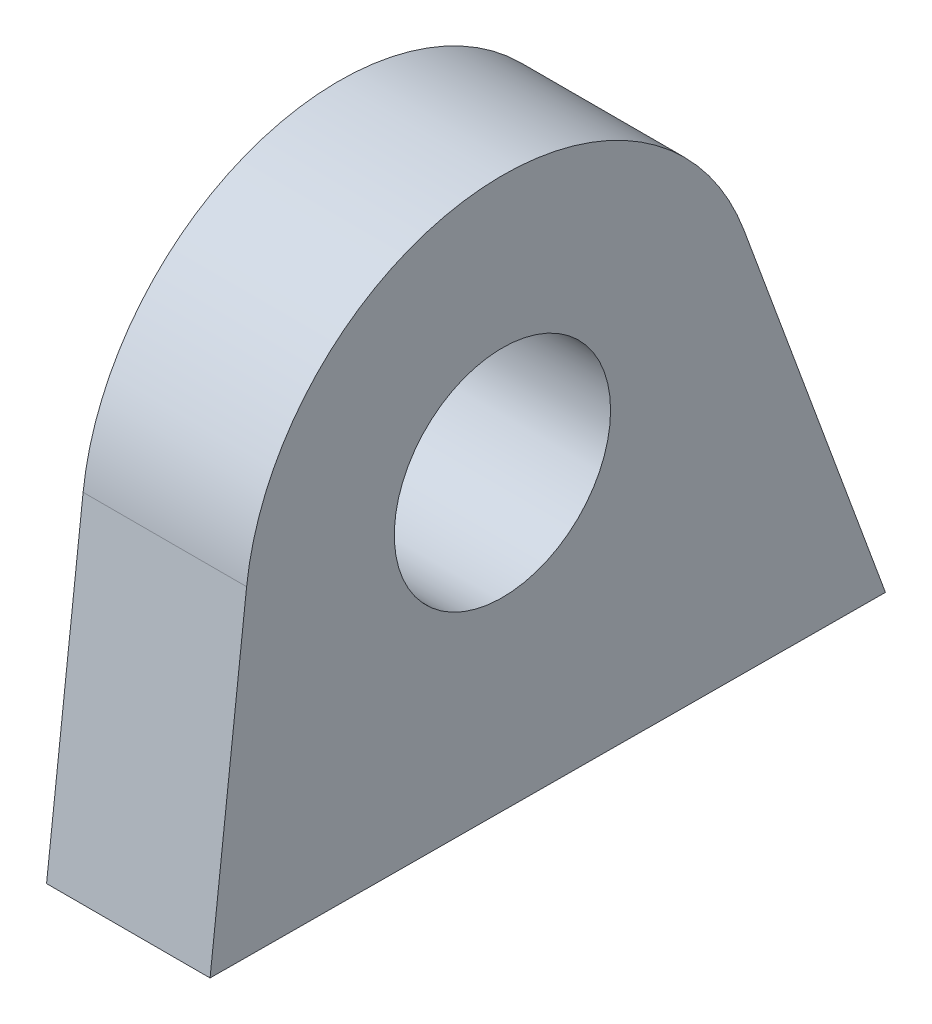
ISO-10303-21;
HEADER;
FILE_DESCRIPTION(('STEP AP214'),'2;1');
FILE_NAME('part.step','',(''),(''),'','','');
FILE_SCHEMA(('AUTOMOTIVE_DESIGN { 1 0 10303 214 1 1 1 1 }'));
ENDSEC;
DATA;
#1=APPLICATION_CONTEXT('core data for automotive mechanical design processes');
#2=APPLICATION_PROTOCOL_DEFINITION('international standard','automotive_design',2000,#1);
#3=PRODUCT_CONTEXT('',#1,'mechanical');
#4=PRODUCT('Part','Part','',(#3));
#5=PRODUCT_RELATED_PRODUCT_CATEGORY('part','',(#4));
#6=PRODUCT_DEFINITION_FORMATION('','',#4);
#7=PRODUCT_DEFINITION_CONTEXT('part definition',#1,'design');
#8=PRODUCT_DEFINITION('design','',#6,#7);
#9=PRODUCT_DEFINITION_SHAPE('','',#8);
#10=(LENGTH_UNIT() NAMED_UNIT(*) SI_UNIT(.MILLI.,.METRE.));
#11=(NAMED_UNIT(*) PLANE_ANGLE_UNIT() SI_UNIT($,.RADIAN.));
#12=(NAMED_UNIT(*) SI_UNIT($,.STERADIAN.) SOLID_ANGLE_UNIT());
#13=UNCERTAINTY_MEASURE_WITH_UNIT(LENGTH_MEASURE(1.E-05),#10,'distance_accuracy_value','');
#14=(GEOMETRIC_REPRESENTATION_CONTEXT(3) GLOBAL_UNCERTAINTY_ASSIGNED_CONTEXT((#13)) GLOBAL_UNIT_ASSIGNED_CONTEXT((#10,
#11,#12)) REPRESENTATION_CONTEXT('',''));
#15=CARTESIAN_POINT('',(0.,0.,0.));
#16=DIRECTION('',(0.,0.,1.));
#17=DIRECTION('',(1.,0.,0.));
#18=AXIS2_PLACEMENT_3D('',#15,#16,#17);
#19=CARTESIAN_POINT('',(77.6424000700384,357.223601629017,-907.3289681282));
#20=DIRECTION('',(1.,0.,0.));
#21=DIRECTION('',(0.,0.,-1.));
#22=AXIS2_PLACEMENT_3D('',#19,#20,#21);
#23=PLANE('',#22);
#24=DIRECTION('',(0.,-0.00556515698933398,-0.99998451439394));
#25=VECTOR('',#24,1.);
#26=CARTESIAN_POINT('',(77.6424000700384,345.904541612259,-895.973808013485));
#27=LINE('',#26,#25);
#28=CARTESIAN_POINT('',(77.6424000700384,345.904541612259,-895.973808013485));
#29=VERTEX_POINT('',#28);
#30=CARTESIAN_POINT('',(77.6424000700384,345.75856303103,-922.204212823623));
#31=VERTEX_POINT('',#30);
#32=EDGE_CURVE('E89',#29,#31,#27,.T.);
#33=ORIENTED_EDGE('',*,*,#32,.T.);
#34=DIRECTION('',(0.,0.938461388630793,0.345384165892363));
#35=VECTOR('',#34,1.);
#36=CARTESIAN_POINT('',(77.6424000700384,360.677443287941,-916.713582014508));
#37=LINE('',#36,#35);
#38=CARTESIAN_POINT('',(77.6424000700384,360.677443287941,-916.713582014508));
#39=VERTEX_POINT('',#38);
#40=EDGE_CURVE('E84',#31,#39,#37,.T.);
#41=ORIENTED_EDGE('',*,*,#40,.T.);
#42=CARTESIAN_POINT('',(77.6424000700384,357.223601629017,-907.3289681282));
#43=DIRECTION('',(1.,0.,0.));
#44=DIRECTION('',(0.,0.,-1.));
#45=AXIS2_PLACEMENT_3D('',#42,#43,#44);
#46=CIRCLE('',#45,10.0000000000001);
#47=CARTESIAN_POINT('',(77.6424000700384,358.356278754938,-897.393323079768));
#48=VERTEX_POINT('',#47);
#49=EDGE_CURVE('E87',#39,#48,#46,.T.);
#50=ORIENTED_EDGE('',*,*,#49,.T.);
#51=DIRECTION('',(0.,-0.993564504843119,0.113267712592103));
#52=VECTOR('',#51,1.);
#53=CARTESIAN_POINT('',(77.6424000700384,358.356278754938,-897.393323079768));
#54=LINE('',#53,#52);
#55=EDGE_CURVE('E54',#48,#29,#54,.T.);
#56=ORIENTED_EDGE('',*,*,#55,.T.);
#57=EDGE_LOOP('',(#33,#41,#50,#56));
#58=FACE_BOUND('',#57,.T.);
#59=CARTESIAN_POINT('',(77.6424000700384,357.223601629017,-907.3289681282));
#60=DIRECTION('',(1.,0.,0.));
#61=DIRECTION('',(0.,0.,-1.));
#62=AXIS2_PLACEMENT_3D('',#59,#60,#61);
#63=CIRCLE('',#62,4.2000000000001);
#64=CARTESIAN_POINT('',(77.6424000700384,357.223601629017,-911.5289681282));
#65=VERTEX_POINT('',#64);
#66=EDGE_CURVE('E104',#65,#65,#63,.T.);
#67=ORIENTED_EDGE('',*,*,#66,.F.);
#68=EDGE_LOOP('',(#67));
#69=FACE_BOUND('',#68,.T.);
#70=ADVANCED_FACE('F37',(#58,#69),#23,.T.);
#71=CARTESIAN_POINT('',(71.2924000700384,357.223601629017,-907.3289681282));
#72=DIRECTION('',(1.,0.,0.));
#73=DIRECTION('',(0.,0.,-1.));
#74=AXIS2_PLACEMENT_3D('',#71,#72,#73);
#75=PLANE('',#74);
#76=DIRECTION('',(0.,-0.00556515698933398,-0.99998451439394));
#77=VECTOR('',#76,1.);
#78=CARTESIAN_POINT('',(71.2924000700384,345.904541612259,-895.973808013485));
#79=LINE('',#78,#77);
#80=CARTESIAN_POINT('',(71.2924000700384,345.904541612259,-895.973808013485));
#81=VERTEX_POINT('',#80);
#82=CARTESIAN_POINT('',(71.2924000700384,345.75856303103,-922.204212823623));
#83=VERTEX_POINT('',#82);
#84=EDGE_CURVE('E101',#81,#83,#79,.T.);
#85=ORIENTED_EDGE('',*,*,#84,.F.);
#86=DIRECTION('',(0.,-0.993564504843119,0.113267712592103));
#87=VECTOR('',#86,1.);
#88=CARTESIAN_POINT('',(71.2924000700384,358.356278754938,-897.393323079768));
#89=LINE('',#88,#87);
#90=CARTESIAN_POINT('',(71.2924000700384,358.356278754938,-897.393323079768));
#91=VERTEX_POINT('',#90);
#92=EDGE_CURVE('E77',#91,#81,#89,.T.);
#93=ORIENTED_EDGE('',*,*,#92,.F.);
#94=CARTESIAN_POINT('',(71.2924000700384,357.223601629017,-907.3289681282));
#95=DIRECTION('',(1.,0.,0.));
#96=DIRECTION('',(0.,0.,-1.));
#97=AXIS2_PLACEMENT_3D('',#94,#95,#96);
#98=CIRCLE('',#97,10.0000000000001);
#99=CARTESIAN_POINT('',(71.2924000700384,360.677443287941,-916.713582014508));
#100=VERTEX_POINT('',#99);
#101=EDGE_CURVE('E71',#100,#91,#98,.T.);
#102=ORIENTED_EDGE('',*,*,#101,.F.);
#103=DIRECTION('',(0.,0.938461388630793,0.345384165892363));
#104=VECTOR('',#103,1.);
#105=CARTESIAN_POINT('',(71.2924000700384,360.677443287941,-916.713582014508));
#106=LINE('',#105,#104);
#107=EDGE_CURVE('E93',#83,#100,#106,.T.);
#108=ORIENTED_EDGE('',*,*,#107,.F.);
#109=EDGE_LOOP('',(#85,#93,#102,#108));
#110=FACE_BOUND('',#109,.T.);
#111=CARTESIAN_POINT('',(71.2924000700384,357.223601629017,-907.3289681282));
#112=DIRECTION('',(1.,0.,0.));
#113=DIRECTION('',(0.,0.,-1.));
#114=AXIS2_PLACEMENT_3D('',#111,#112,#113);
#115=CIRCLE('',#114,4.2000000000001);
#116=CARTESIAN_POINT('',(71.2924000700384,357.223601629017,-911.5289681282));
#117=VERTEX_POINT('',#116);
#118=EDGE_CURVE('E116',#117,#117,#115,.T.);
#119=ORIENTED_EDGE('',*,*,#118,.T.);
#120=EDGE_LOOP('',(#119));
#121=FACE_BOUND('',#120,.T.);
#122=ADVANCED_FACE('F112',(#110,#121),#75,.F.);
#123=CARTESIAN_POINT('',(77.6424000700384,345.904541612259,-895.973808013485));
#124=DIRECTION('',(0.,0.99998451439394,-0.00556515698933398));
#125=DIRECTION('',(0.,0.00556515698933398,0.99998451439394));
#126=AXIS2_PLACEMENT_3D('',#123,#124,#125);
#127=PLANE('',#126);
#128=ORIENTED_EDGE('',*,*,#84,.T.);
#129=DIRECTION('',(-1.,0.,0.));
#130=VECTOR('',#129,1.);
#131=CARTESIAN_POINT('',(77.6424000700384,345.75856303103,-922.204212823623));
#132=LINE('',#131,#130);
#133=EDGE_CURVE('E11',#31,#83,#132,.T.);
#134=ORIENTED_EDGE('',*,*,#133,.F.);
#135=ORIENTED_EDGE('',*,*,#32,.F.);
#136=DIRECTION('',(-1.,0.,0.));
#137=VECTOR('',#136,1.);
#138=CARTESIAN_POINT('',(77.6424000700384,345.904541612259,-895.973808013485));
#139=LINE('',#138,#137);
#140=EDGE_CURVE('E97',#29,#81,#139,.T.);
#141=ORIENTED_EDGE('',*,*,#140,.T.);
#142=EDGE_LOOP('',(#128,#134,#135,#141));
#143=FACE_BOUND('',#142,.T.);
#144=ADVANCED_FACE('F39',(#143),#127,.F.);
#145=CARTESIAN_POINT('',(77.6424000700384,360.677443287941,-916.713582014508));
#146=DIRECTION('',(0.,-0.345384165892363,0.938461388630793));
#147=DIRECTION('',(0.,-0.938461388630793,-0.345384165892363));
#148=AXIS2_PLACEMENT_3D('',#145,#146,#147);
#149=PLANE('',#148);
#150=ORIENTED_EDGE('',*,*,#107,.T.);
#151=DIRECTION('',(-1.,0.,0.));
#152=VECTOR('',#151,1.);
#153=CARTESIAN_POINT('',(77.6424000700384,360.677443287941,-916.713582014508));
#154=LINE('',#153,#152);
#155=EDGE_CURVE('E46',#39,#100,#154,.T.);
#156=ORIENTED_EDGE('',*,*,#155,.F.);
#157=ORIENTED_EDGE('',*,*,#40,.F.);
#158=ORIENTED_EDGE('',*,*,#133,.T.);
#159=EDGE_LOOP('',(#150,#156,#157,#158));
#160=FACE_BOUND('',#159,.T.);
#161=ADVANCED_FACE('F92',(#160),#149,.F.);
#162=CARTESIAN_POINT('',(77.6424000700384,357.223601629017,-907.3289681282));
#163=DIRECTION('',(-1.,0.,0.));
#164=DIRECTION('',(0.,0.,1.));
#165=AXIS2_PLACEMENT_3D('',#162,#163,#164);
#166=CYLINDRICAL_SURFACE('',#165,10.0000000000001);
#167=ORIENTED_EDGE('',*,*,#101,.T.);
#168=DIRECTION('',(-1.,0.,0.));
#169=VECTOR('',#168,1.);
#170=CARTESIAN_POINT('',(77.6424000700384,358.356278754938,-897.393323079768));
#171=LINE('',#170,#169);
#172=EDGE_CURVE('E94',#48,#91,#171,.T.);
#173=ORIENTED_EDGE('',*,*,#172,.F.);
#174=ORIENTED_EDGE('',*,*,#49,.F.);
#175=ORIENTED_EDGE('',*,*,#155,.T.);
#176=EDGE_LOOP('',(#167,#173,#174,#175));
#177=FACE_BOUND('',#176,.T.);
#178=ADVANCED_FACE('F95',(#177),#166,.T.);
#179=CARTESIAN_POINT('',(77.6424000700384,358.356278754938,-897.393323079768));
#180=DIRECTION('',(0.,-0.113267712592103,-0.993564504843119));
#181=DIRECTION('',(0.,0.993564504843119,-0.113267712592103));
#182=AXIS2_PLACEMENT_3D('',#179,#180,#181);
#183=PLANE('',#182);
#184=ORIENTED_EDGE('',*,*,#92,.T.);
#185=ORIENTED_EDGE('',*,*,#140,.F.);
#186=ORIENTED_EDGE('',*,*,#55,.F.);
#187=ORIENTED_EDGE('',*,*,#172,.T.);
#188=EDGE_LOOP('',(#184,#185,#186,#187));
#189=FACE_BOUND('',#188,.T.);
#190=ADVANCED_FACE('F109',(#189),#183,.F.);
#191=CARTESIAN_POINT('',(77.6424000700384,357.223601629017,-907.3289681282));
#192=DIRECTION('',(-1.,0.,0.));
#193=DIRECTION('',(0.,0.,1.));
#194=AXIS2_PLACEMENT_3D('',#191,#192,#193);
#195=CYLINDRICAL_SURFACE('',#194,4.2000000000001);
#196=ORIENTED_EDGE('',*,*,#66,.T.);
#197=EDGE_LOOP('',(#196));
#198=FACE_BOUND('',#197,.T.);
#199=ORIENTED_EDGE('',*,*,#118,.F.);
#200=EDGE_LOOP('',(#199));
#201=FACE_BOUND('',#200,.T.);
#202=ADVANCED_FACE('F122',(#198,#201),#195,.F.);
#203=CLOSED_SHELL('',(#70,#122,#144,#161,#178,#190,#202));
#204=MANIFOLD_SOLID_BREP('B2',#203);
#205=ADVANCED_BREP_SHAPE_REPRESENTATION('',(#18,#204),#14);
#206=SHAPE_DEFINITION_REPRESENTATION(#9,#205);
ENDSEC;
END-ISO-10303-21;
